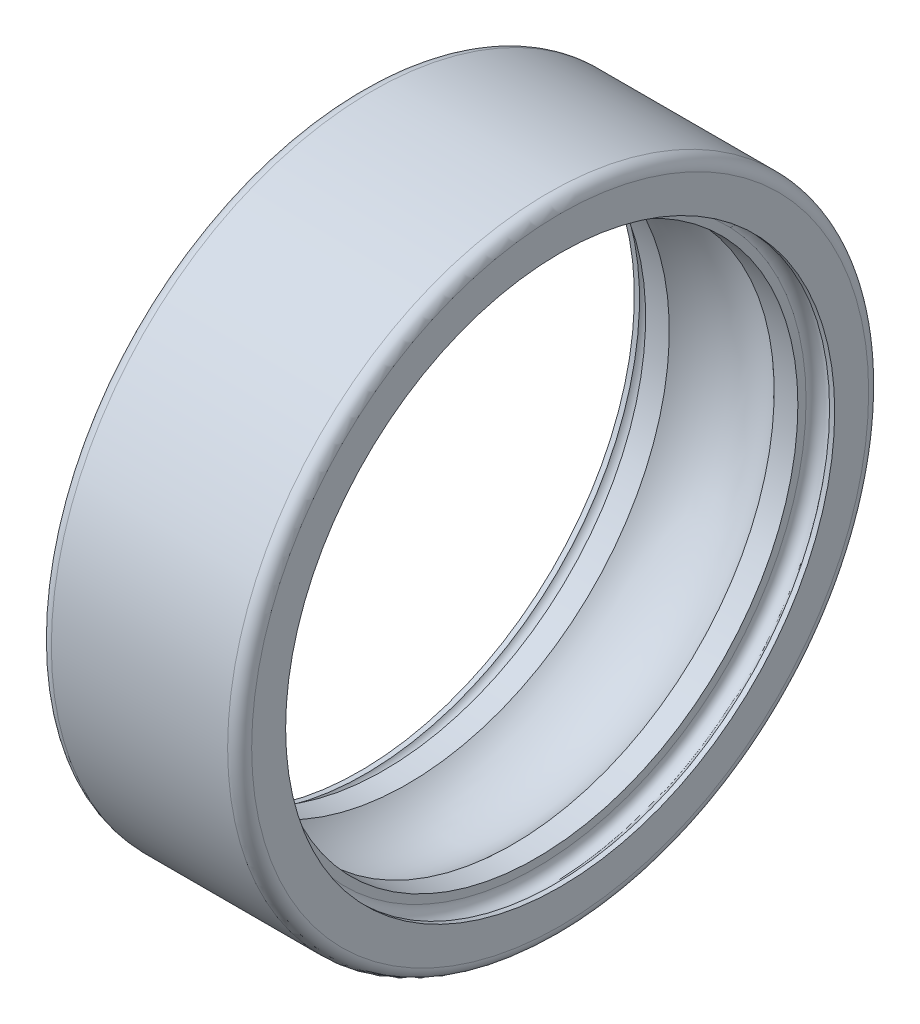
ISO-10303-21;
HEADER;
FILE_DESCRIPTION(('STEP AP214'),'2;1');
FILE_NAME('part.step','',(''),(''),'','','');
FILE_SCHEMA(('AUTOMOTIVE_DESIGN { 1 0 10303 214 1 1 1 1 }'));
ENDSEC;
DATA;
#1=APPLICATION_CONTEXT('core data for automotive mechanical design processes');
#2=APPLICATION_PROTOCOL_DEFINITION('international standard','automotive_design',2000,#1);
#3=PRODUCT_CONTEXT('',#1,'mechanical');
#4=PRODUCT('Part','Part','',(#3));
#5=PRODUCT_RELATED_PRODUCT_CATEGORY('part','',(#4));
#6=PRODUCT_DEFINITION_FORMATION('','',#4);
#7=PRODUCT_DEFINITION_CONTEXT('part definition',#1,'design');
#8=PRODUCT_DEFINITION('design','',#6,#7);
#9=PRODUCT_DEFINITION_SHAPE('','',#8);
#10=(LENGTH_UNIT() NAMED_UNIT(*) SI_UNIT(.MILLI.,.METRE.));
#11=(NAMED_UNIT(*) PLANE_ANGLE_UNIT() SI_UNIT($,.RADIAN.));
#12=(NAMED_UNIT(*) SI_UNIT($,.STERADIAN.) SOLID_ANGLE_UNIT());
#13=UNCERTAINTY_MEASURE_WITH_UNIT(LENGTH_MEASURE(1.E-05),#10,'distance_accuracy_value','');
#14=(GEOMETRIC_REPRESENTATION_CONTEXT(3) GLOBAL_UNCERTAINTY_ASSIGNED_CONTEXT((#13)) GLOBAL_UNIT_ASSIGNED_CONTEXT((#10,
#11,#12)) REPRESENTATION_CONTEXT('',''));
#15=CARTESIAN_POINT('',(0.,0.,0.));
#16=DIRECTION('',(0.,0.,1.));
#17=DIRECTION('',(1.,0.,0.));
#18=AXIS2_PLACEMENT_3D('',#15,#16,#17);
#19=CARTESIAN_POINT('',(0.,0.,0.));
#20=DIRECTION('',(-1.,0.,0.));
#21=DIRECTION('',(0.,0.,1.));
#22=AXIS2_PLACEMENT_3D('',#19,#20,#21);
#23=CYLINDRICAL_SURFACE('',#22,6.53333333333333);
#24=CARTESIAN_POINT('',(3.80926187856619,0.,0.));
#25=DIRECTION('',(-1.,0.,0.));
#26=DIRECTION('',(0.,0.,1.));
#27=AXIS2_PLACEMENT_3D('',#24,#25,#26);
#28=CIRCLE('',#27,6.53333333333333);
#29=CARTESIAN_POINT('',(3.80926187856619,0.,6.53333333333333));
#30=VERTEX_POINT('',#29);
#31=EDGE_CURVE('E44',#30,#30,#28,.T.);
#32=ORIENTED_EDGE('',*,*,#31,.T.);
#33=EDGE_LOOP('',(#32));
#34=FACE_BOUND('',#33,.T.);
#35=CARTESIAN_POINT('',(4.4,0.,0.));
#36=DIRECTION('',(1.,0.,0.));
#37=DIRECTION('',(0.,0.,-1.));
#38=AXIS2_PLACEMENT_3D('',#35,#36,#37);
#39=CIRCLE('',#38,6.53333333333333);
#40=CARTESIAN_POINT('',(4.4,0.,-6.53333333333333));
#41=VERTEX_POINT('',#40);
#42=EDGE_CURVE('E17',#41,#41,#39,.T.);
#43=ORIENTED_EDGE('',*,*,#42,.T.);
#44=EDGE_LOOP('',(#43));
#45=FACE_BOUND('',#44,.T.);
#46=ADVANCED_FACE('F14',(#34,#45),#23,.F.);
#47=CARTESIAN_POINT('',(0.,0.,0.));
#48=DIRECTION('',(-1.,0.,0.));
#49=DIRECTION('',(0.,0.,1.));
#50=AXIS2_PLACEMENT_3D('',#47,#48,#49);
#51=CYLINDRICAL_SURFACE('',#50,6.53333333333333);
#52=CARTESIAN_POINT('',(1.19073812143381,0.,0.));
#53=DIRECTION('',(-1.,0.,0.));
#54=DIRECTION('',(0.,0.,1.));
#55=AXIS2_PLACEMENT_3D('',#52,#53,#54);
#56=CIRCLE('',#55,6.53333333333333);
#57=CARTESIAN_POINT('',(1.19073812143381,0.,6.53333333333333));
#58=VERTEX_POINT('',#57);
#59=EDGE_CURVE('E77',#58,#58,#56,.T.);
#60=ORIENTED_EDGE('',*,*,#59,.F.);
#61=EDGE_LOOP('',(#60));
#62=FACE_BOUND('',#61,.T.);
#63=CARTESIAN_POINT('',(0.6,0.,0.));
#64=DIRECTION('',(-1.,0.,0.));
#65=DIRECTION('',(0.,0.,1.));
#66=AXIS2_PLACEMENT_3D('',#63,#64,#65);
#67=CIRCLE('',#66,6.53333333333333);
#68=CARTESIAN_POINT('',(0.6,0.,6.53333333333333));
#69=VERTEX_POINT('',#68);
#70=EDGE_CURVE('E36',#69,#69,#67,.F.);
#71=ORIENTED_EDGE('',*,*,#70,.F.);
#72=EDGE_LOOP('',(#71));
#73=FACE_BOUND('',#72,.T.);
#74=ADVANCED_FACE('F107',(#62,#73),#51,.F.);
#75=CARTESIAN_POINT('',(5.,6.53333333333333,0.));
#76=DIRECTION('',(-1.,0.,0.));
#77=DIRECTION('',(0.,0.,1.));
#78=AXIS2_PLACEMENT_3D('',#75,#76,#77);
#79=PLANE('',#78);
#80=CARTESIAN_POINT('',(5.,0.,0.));
#81=DIRECTION('',(-1.,0.,0.));
#82=DIRECTION('',(0.,0.,1.));
#83=AXIS2_PLACEMENT_3D('',#80,#81,#82);
#84=CIRCLE('',#83,6.85233333333334);
#85=CARTESIAN_POINT('',(5.,0.,6.85233333333334));
#86=VERTEX_POINT('',#85);
#87=EDGE_CURVE('E45',#86,#86,#84,.T.);
#88=ORIENTED_EDGE('',*,*,#87,.T.);
#89=EDGE_LOOP('',(#88));
#90=FACE_BOUND('',#89,.T.);
#91=CARTESIAN_POINT('',(5.,0.,0.));
#92=DIRECTION('',(-1.,0.,0.));
#93=DIRECTION('',(0.,0.,1.));
#94=AXIS2_PLACEMENT_3D('',#91,#92,#93);
#95=CIRCLE('',#94,7.7);
#96=CARTESIAN_POINT('',(5.,0.,7.7));
#97=VERTEX_POINT('',#96);
#98=EDGE_CURVE('E10',#97,#97,#95,.T.);
#99=ORIENTED_EDGE('',*,*,#98,.F.);
#100=EDGE_LOOP('',(#99));
#101=FACE_BOUND('',#100,.T.);
#102=ADVANCED_FACE('F101',(#90,#101),#79,.F.);
#103=CARTESIAN_POINT('',(4.7,0.,0.));
#104=DIRECTION('',(-1.,0.,0.));
#105=DIRECTION('',(0.,0.,1.));
#106=AXIS2_PLACEMENT_3D('',#103,#104,#105);
#107=TOROIDAL_SURFACE('',#106,7.7,0.3);
#108=CARTESIAN_POINT('',(4.7,0.,0.));
#109=DIRECTION('',(-1.,0.,0.));
#110=DIRECTION('',(0.,0.,1.));
#111=AXIS2_PLACEMENT_3D('',#108,#109,#110);
#112=CIRCLE('',#111,8.);
#113=CARTESIAN_POINT('',(4.7,0.,8.));
#114=VERTEX_POINT('',#113);
#115=EDGE_CURVE('E22',#114,#114,#112,.T.);
#116=ORIENTED_EDGE('',*,*,#115,.F.);
#117=EDGE_LOOP('',(#116));
#118=FACE_BOUND('',#117,.T.);
#119=ORIENTED_EDGE('',*,*,#98,.T.);
#120=EDGE_LOOP('',(#119));
#121=FACE_BOUND('',#120,.T.);
#122=ADVANCED_FACE('F96',(#118,#121),#107,.T.);
#123=CARTESIAN_POINT('',(0.,0.,0.));
#124=DIRECTION('',(-1.,0.,0.));
#125=DIRECTION('',(0.,0.,1.));
#126=AXIS2_PLACEMENT_3D('',#123,#124,#125);
#127=CYLINDRICAL_SURFACE('',#126,8.);
#128=CARTESIAN_POINT('',(0.3,0.,0.));
#129=DIRECTION('',(-1.,0.,0.));
#130=DIRECTION('',(0.,0.,1.));
#131=AXIS2_PLACEMENT_3D('',#128,#129,#130);
#132=CIRCLE('',#131,8.);
#133=CARTESIAN_POINT('',(0.3,0.,8.));
#134=VERTEX_POINT('',#133);
#135=EDGE_CURVE('E32',#134,#134,#132,.T.);
#136=ORIENTED_EDGE('',*,*,#135,.F.);
#137=EDGE_LOOP('',(#136));
#138=FACE_BOUND('',#137,.T.);
#139=ORIENTED_EDGE('',*,*,#115,.T.);
#140=EDGE_LOOP('',(#139));
#141=FACE_BOUND('',#140,.T.);
#142=ADVANCED_FACE('F93',(#138,#141),#127,.T.);
#143=CARTESIAN_POINT('',(0.3,0.,0.));
#144=DIRECTION('',(-1.,0.,0.));
#145=DIRECTION('',(0.,0.,1.));
#146=AXIS2_PLACEMENT_3D('',#143,#144,#145);
#147=TOROIDAL_SURFACE('',#146,7.7,0.3);
#148=CARTESIAN_POINT('',(0.,0.,0.));
#149=DIRECTION('',(-1.,0.,0.));
#150=DIRECTION('',(0.,0.,1.));
#151=AXIS2_PLACEMENT_3D('',#148,#149,#150);
#152=CIRCLE('',#151,7.7);
#153=CARTESIAN_POINT('',(0.,0.,7.7));
#154=VERTEX_POINT('',#153);
#155=EDGE_CURVE('E81',#154,#154,#152,.T.);
#156=ORIENTED_EDGE('',*,*,#155,.F.);
#157=EDGE_LOOP('',(#156));
#158=FACE_BOUND('',#157,.T.);
#159=ORIENTED_EDGE('',*,*,#135,.T.);
#160=EDGE_LOOP('',(#159));
#161=FACE_BOUND('',#160,.T.);
#162=ADVANCED_FACE('F91',(#158,#161),#147,.T.);
#163=CARTESIAN_POINT('',(0.,6.53333333333333,0.));
#164=DIRECTION('',(-1.,0.,0.));
#165=DIRECTION('',(0.,0.,1.));
#166=AXIS2_PLACEMENT_3D('',#163,#164,#165);
#167=PLANE('',#166);
#168=CARTESIAN_POINT('',(0.,0.,0.));
#169=DIRECTION('',(-1.,0.,0.));
#170=DIRECTION('',(0.,0.,1.));
#171=AXIS2_PLACEMENT_3D('',#168,#169,#170);
#172=CIRCLE('',#171,6.85233333333334);
#173=CARTESIAN_POINT('',(0.,0.,6.85233333333334));
#174=VERTEX_POINT('',#173);
#175=EDGE_CURVE('E40',#174,#174,#172,.T.);
#176=ORIENTED_EDGE('',*,*,#175,.F.);
#177=EDGE_LOOP('',(#176));
#178=FACE_BOUND('',#177,.T.);
#179=ORIENTED_EDGE('',*,*,#155,.T.);
#180=EDGE_LOOP('',(#179));
#181=FACE_BOUND('',#180,.T.);
#182=ADVANCED_FACE('F147',(#178,#181),#167,.T.);
#183=CARTESIAN_POINT('',(2.5,0.,0.));
#184=DIRECTION('',(-1.,0.,0.));
#185=DIRECTION('',(0.,0.,1.));
#186=AXIS2_PLACEMENT_3D('',#183,#184,#185);
#187=TOROIDAL_SURFACE('',#186,5.25,1.83333333333333);
#188=ORIENTED_EDGE('',*,*,#59,.T.);
#189=EDGE_LOOP('',(#188));
#190=FACE_BOUND('',#189,.T.);
#191=ORIENTED_EDGE('',*,*,#31,.F.);
#192=EDGE_LOOP('',(#191));
#193=FACE_BOUND('',#192,.T.);
#194=ADVANCED_FACE('F144',(#190,#193),#187,.F.);
#195=CARTESIAN_POINT('',(0.6,3.87053841409022,0.));
#196=DIRECTION('',(-1.,0.,0.));
#197=DIRECTION('',(0.,0.,1.));
#198=AXIS2_PLACEMENT_3D('',#195,#196,#197);
#199=PLANE('',#198);
#200=CARTESIAN_POINT('',(0.6,0.,0.));
#201=DIRECTION('',(-1.,0.,0.));
#202=DIRECTION('',(0.,0.,1.));
#203=AXIS2_PLACEMENT_3D('',#200,#201,#202);
#204=CIRCLE('',#203,6.73733333333333);
#205=CARTESIAN_POINT('',(0.6,0.,6.73733333333333));
#206=VERTEX_POINT('',#205);
#207=EDGE_CURVE('E41',#206,#206,#204,.T.);
#208=ORIENTED_EDGE('',*,*,#207,.T.);
#209=EDGE_LOOP('',(#208));
#210=FACE_BOUND('',#209,.T.);
#211=ORIENTED_EDGE('',*,*,#70,.T.);
#212=EDGE_LOOP('',(#211));
#213=FACE_BOUND('',#212,.T.);
#214=ADVANCED_FACE('F140',(#210,#213),#199,.T.);
#215=CARTESIAN_POINT('',(0.35,0.,0.));
#216=DIRECTION('',(-1.,0.,0.));
#217=DIRECTION('',(0.,0.,1.));
#218=AXIS2_PLACEMENT_3D('',#215,#216,#217);
#219=TOROIDAL_SURFACE('',#218,6.73733333333333,0.25);
#220=CARTESIAN_POINT('',(0.128020271195766,0.,0.));
#221=DIRECTION('',(-1.,0.,0.));
#222=DIRECTION('',(0.,0.,1.));
#223=AXIS2_PLACEMENT_3D('',#220,#221,#222);
#224=CIRCLE('',#223,6.85233333333334);
#225=CARTESIAN_POINT('',(0.128020271195766,0.,6.85233333333334));
#226=VERTEX_POINT('',#225);
#227=EDGE_CURVE('E54',#226,#226,#224,.T.);
#228=ORIENTED_EDGE('',*,*,#227,.T.);
#229=EDGE_LOOP('',(#228));
#230=FACE_BOUND('',#229,.T.);
#231=ORIENTED_EDGE('',*,*,#207,.F.);
#232=EDGE_LOOP('',(#231));
#233=FACE_BOUND('',#232,.T.);
#234=ADVANCED_FACE('F136',(#230,#233),#219,.F.);
#235=CARTESIAN_POINT('',(-1.,0.,0.));
#236=DIRECTION('',(-1.,0.,0.));
#237=DIRECTION('',(0.,0.,1.));
#238=AXIS2_PLACEMENT_3D('',#235,#236,#237);
#239=CYLINDRICAL_SURFACE('',#238,6.85233333333334);
#240=ORIENTED_EDGE('',*,*,#175,.T.);
#241=EDGE_LOOP('',(#240));
#242=FACE_BOUND('',#241,.T.);
#243=ORIENTED_EDGE('',*,*,#227,.F.);
#244=EDGE_LOOP('',(#243));
#245=FACE_BOUND('',#244,.T.);
#246=ADVANCED_FACE('F130',(#242,#245),#239,.F.);
#247=CARTESIAN_POINT('',(6.,0.,0.));
#248=DIRECTION('',(1.,0.,0.));
#249=DIRECTION('',(0.,0.,-1.));
#250=AXIS2_PLACEMENT_3D('',#247,#248,#249);
#251=CYLINDRICAL_SURFACE('',#250,6.85233333333334);
#252=CARTESIAN_POINT('',(4.87197972880423,0.,0.));
#253=DIRECTION('',(1.,0.,0.));
#254=DIRECTION('',(0.,0.,-1.));
#255=AXIS2_PLACEMENT_3D('',#252,#253,#254);
#256=CIRCLE('',#255,6.85233333333334);
#257=CARTESIAN_POINT('',(4.87197972880423,0.,-6.85233333333334));
#258=VERTEX_POINT('',#257);
#259=EDGE_CURVE('E57',#258,#258,#256,.T.);
#260=ORIENTED_EDGE('',*,*,#259,.F.);
#261=EDGE_LOOP('',(#260));
#262=FACE_BOUND('',#261,.T.);
#263=ORIENTED_EDGE('',*,*,#87,.F.);
#264=EDGE_LOOP('',(#263));
#265=FACE_BOUND('',#264,.T.);
#266=ADVANCED_FACE('F122',(#262,#265),#251,.F.);
#267=CARTESIAN_POINT('',(4.4,3.87053841409022,0.));
#268=DIRECTION('',(1.,0.,0.));
#269=DIRECTION('',(0.,0.,-1.));
#270=AXIS2_PLACEMENT_3D('',#267,#268,#269);
#271=PLANE('',#270);
#272=ORIENTED_EDGE('',*,*,#42,.F.);
#273=EDGE_LOOP('',(#272));
#274=FACE_BOUND('',#273,.T.);
#275=CARTESIAN_POINT('',(4.4,0.,0.));
#276=DIRECTION('',(1.,0.,0.));
#277=DIRECTION('',(0.,0.,-1.));
#278=AXIS2_PLACEMENT_3D('',#275,#276,#277);
#279=CIRCLE('',#278,6.73733333333333);
#280=CARTESIAN_POINT('',(4.4,0.,-6.73733333333333));
#281=VERTEX_POINT('',#280);
#282=EDGE_CURVE('E47',#281,#281,#279,.T.);
#283=ORIENTED_EDGE('',*,*,#282,.T.);
#284=EDGE_LOOP('',(#283));
#285=FACE_BOUND('',#284,.T.);
#286=ADVANCED_FACE('F119',(#274,#285),#271,.T.);
#287=CARTESIAN_POINT('',(4.65,0.,0.));
#288=DIRECTION('',(1.,0.,0.));
#289=DIRECTION('',(0.,0.,-1.));
#290=AXIS2_PLACEMENT_3D('',#287,#288,#289);
#291=TOROIDAL_SURFACE('',#290,6.73733333333333,0.25);
#292=ORIENTED_EDGE('',*,*,#259,.T.);
#293=EDGE_LOOP('',(#292));
#294=FACE_BOUND('',#293,.T.);
#295=ORIENTED_EDGE('',*,*,#282,.F.);
#296=EDGE_LOOP('',(#295));
#297=FACE_BOUND('',#296,.T.);
#298=ADVANCED_FACE('F121',(#294,#297),#291,.F.);
#299=CLOSED_SHELL('',(#46,#74,#102,#122,#142,#162,#182,#194,#214,#234,#246,#266,#286,#298));
#300=MANIFOLD_SOLID_BREP('B1',#299);
#301=ADVANCED_BREP_SHAPE_REPRESENTATION('',(#18,#300),#14);
#302=SHAPE_DEFINITION_REPRESENTATION(#9,#301);
ENDSEC;
END-ISO-10303-21;
